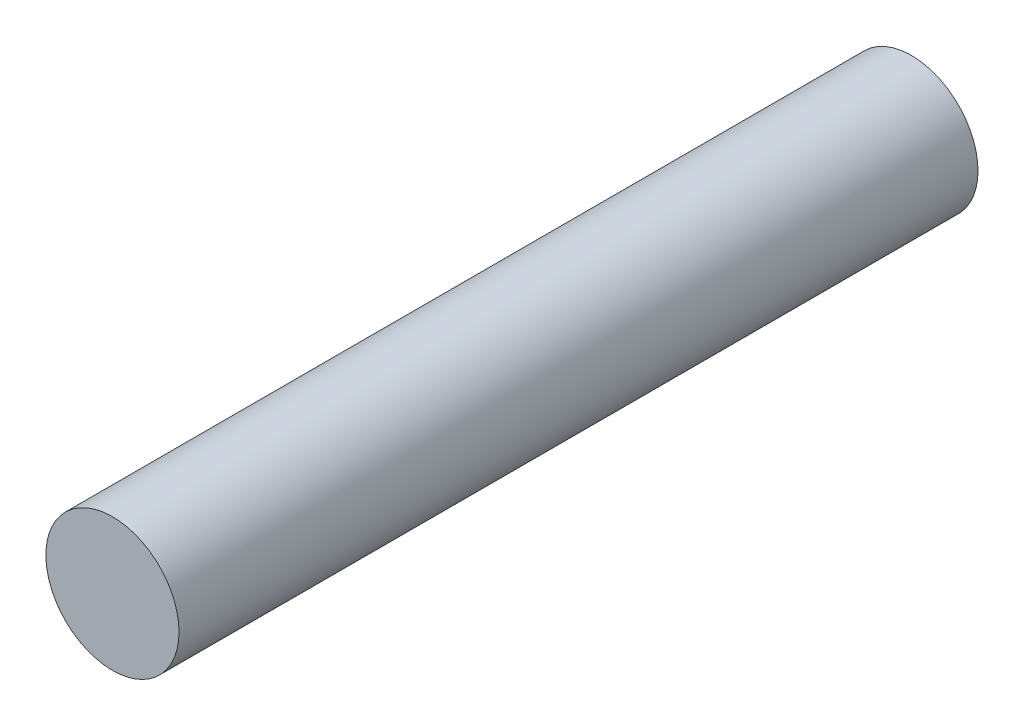
ISO-10303-21;
HEADER;
FILE_DESCRIPTION(('STEP AP214'),'2;1');
FILE_NAME('part.step','',(''),(''),'','','');
FILE_SCHEMA(('AUTOMOTIVE_DESIGN { 1 0 10303 214 1 1 1 1 }'));
ENDSEC;
DATA;
#1=APPLICATION_CONTEXT('core data for automotive mechanical design processes');
#2=APPLICATION_PROTOCOL_DEFINITION('international standard','automotive_design',2000,#1);
#3=PRODUCT_CONTEXT('',#1,'mechanical');
#4=PRODUCT('Part','Part','',(#3));
#5=PRODUCT_RELATED_PRODUCT_CATEGORY('part','',(#4));
#6=PRODUCT_DEFINITION_FORMATION('','',#4);
#7=PRODUCT_DEFINITION_CONTEXT('part definition',#1,'design');
#8=PRODUCT_DEFINITION('design','',#6,#7);
#9=PRODUCT_DEFINITION_SHAPE('','',#8);
#10=(LENGTH_UNIT() NAMED_UNIT(*) SI_UNIT(.MILLI.,.METRE.));
#11=(NAMED_UNIT(*) PLANE_ANGLE_UNIT() SI_UNIT($,.RADIAN.));
#12=(NAMED_UNIT(*) SI_UNIT($,.STERADIAN.) SOLID_ANGLE_UNIT());
#13=UNCERTAINTY_MEASURE_WITH_UNIT(LENGTH_MEASURE(1.E-05),#10,'distance_accuracy_value','');
#14=(GEOMETRIC_REPRESENTATION_CONTEXT(3) GLOBAL_UNCERTAINTY_ASSIGNED_CONTEXT((#13)) GLOBAL_UNIT_ASSIGNED_CONTEXT((#10,
#11,#12)) REPRESENTATION_CONTEXT('',''));
#15=CARTESIAN_POINT('',(0.,0.,0.));
#16=DIRECTION('',(0.,0.,1.));
#17=DIRECTION('',(1.,0.,0.));
#18=AXIS2_PLACEMENT_3D('',#15,#16,#17);
#19=CARTESIAN_POINT('',(0.,0.,30.));
#20=DIRECTION('',(0.,0.,-1.));
#21=DIRECTION('',(-1.,0.,0.));
#22=AXIS2_PLACEMENT_3D('',#19,#20,#21);
#23=CYLINDRICAL_SURFACE('',#22,2.5);
#24=CARTESIAN_POINT('',(0.,0.,30.));
#25=DIRECTION('',(0.,0.,1.));
#26=DIRECTION('',(1.,0.,0.));
#27=AXIS2_PLACEMENT_3D('',#24,#25,#26);
#28=CIRCLE('',#27,2.5);
#29=CARTESIAN_POINT('',(2.5,0.,30.));
#30=VERTEX_POINT('',#29);
#31=EDGE_CURVE('E10',#30,#30,#28,.T.);
#32=ORIENTED_EDGE('',*,*,#31,.F.);
#33=EDGE_LOOP('',(#32));
#34=FACE_BOUND('',#33,.T.);
#35=CARTESIAN_POINT('',(0.,0.,0.));
#36=DIRECTION('',(0.,0.,1.));
#37=DIRECTION('',(1.,0.,0.));
#38=AXIS2_PLACEMENT_3D('',#35,#36,#37);
#39=CIRCLE('',#38,2.5);
#40=CARTESIAN_POINT('',(2.5,0.,0.));
#41=VERTEX_POINT('',#40);
#42=EDGE_CURVE('E44',#41,#41,#39,.T.);
#43=ORIENTED_EDGE('',*,*,#42,.T.);
#44=EDGE_LOOP('',(#43));
#45=FACE_BOUND('',#44,.T.);
#46=ADVANCED_FACE('F41',(#34,#45),#23,.T.);
#47=CARTESIAN_POINT('',(0.,0.,30.));
#48=DIRECTION('',(0.,0.,1.));
#49=DIRECTION('',(1.,0.,0.));
#50=AXIS2_PLACEMENT_3D('',#47,#48,#49);
#51=PLANE('',#50);
#52=ORIENTED_EDGE('',*,*,#31,.T.);
#53=EDGE_LOOP('',(#52));
#54=FACE_BOUND('',#53,.T.);
#55=ADVANCED_FACE('F58',(#54),#51,.T.);
#56=CARTESIAN_POINT('',(0.,0.,0.));
#57=DIRECTION('',(0.,0.,1.));
#58=DIRECTION('',(1.,0.,0.));
#59=AXIS2_PLACEMENT_3D('',#56,#57,#58);
#60=PLANE('',#59);
#61=ORIENTED_EDGE('',*,*,#42,.F.);
#62=EDGE_LOOP('',(#61));
#63=FACE_BOUND('',#62,.T.);
#64=ADVANCED_FACE('F56',(#63),#60,.F.);
#65=CLOSED_SHELL('',(#46,#55,#64));
#66=MANIFOLD_SOLID_BREP('B2',#65);
#67=ADVANCED_BREP_SHAPE_REPRESENTATION('',(#18,#66),#14);
#68=SHAPE_DEFINITION_REPRESENTATION(#9,#67);
ENDSEC;
END-ISO-10303-21;
